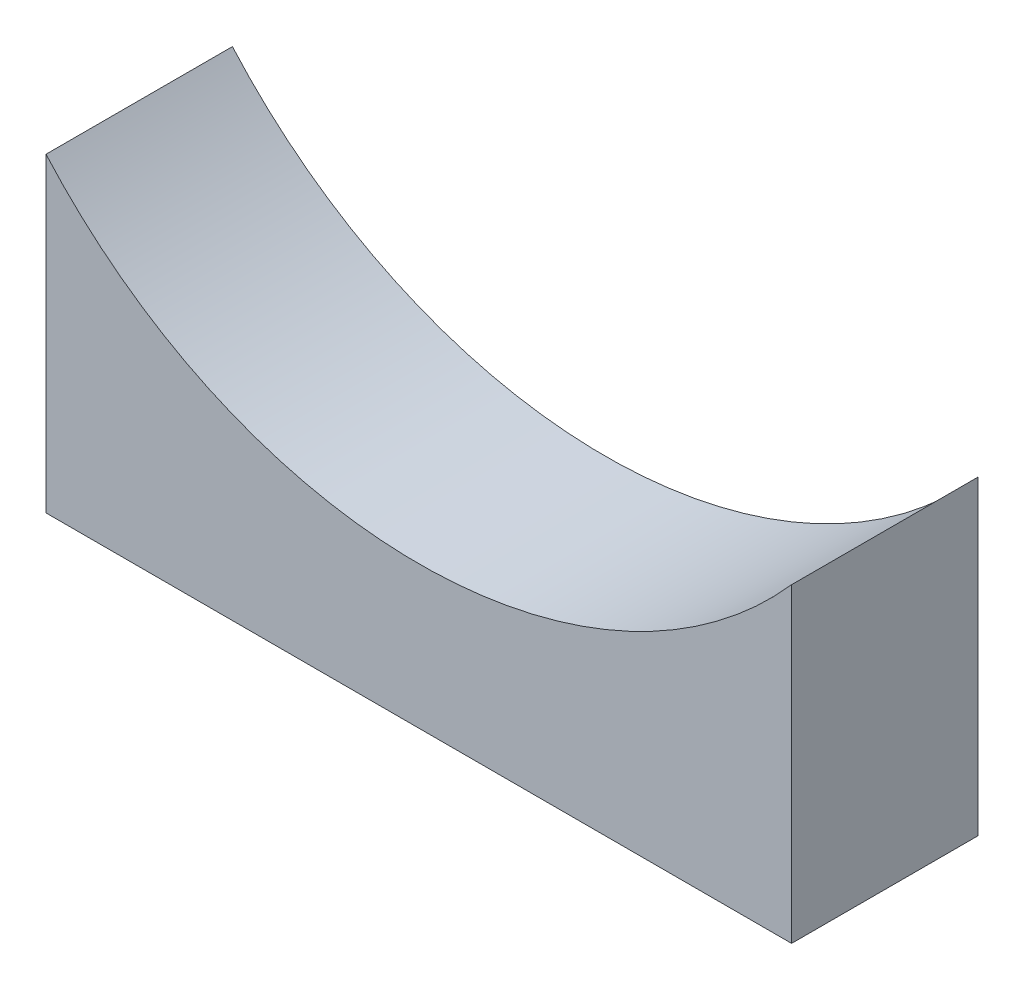
ISO-10303-21;
HEADER;
FILE_DESCRIPTION(('STEP AP214'),'2;1');
FILE_NAME('part.step','',(''),(''),'','','');
FILE_SCHEMA(('AUTOMOTIVE_DESIGN { 1 0 10303 214 1 1 1 1 }'));
ENDSEC;
DATA;
#1=APPLICATION_CONTEXT('core data for automotive mechanical design processes');
#2=APPLICATION_PROTOCOL_DEFINITION('international standard','automotive_design',2000,#1);
#3=PRODUCT_CONTEXT('',#1,'mechanical');
#4=PRODUCT('Part','Part','',(#3));
#5=PRODUCT_RELATED_PRODUCT_CATEGORY('part','',(#4));
#6=PRODUCT_DEFINITION_FORMATION('','',#4);
#7=PRODUCT_DEFINITION_CONTEXT('part definition',#1,'design');
#8=PRODUCT_DEFINITION('design','',#6,#7);
#9=PRODUCT_DEFINITION_SHAPE('','',#8);
#10=(LENGTH_UNIT() NAMED_UNIT(*) SI_UNIT(.MILLI.,.METRE.));
#11=(NAMED_UNIT(*) PLANE_ANGLE_UNIT() SI_UNIT($,.RADIAN.));
#12=(NAMED_UNIT(*) SI_UNIT($,.STERADIAN.) SOLID_ANGLE_UNIT());
#13=UNCERTAINTY_MEASURE_WITH_UNIT(LENGTH_MEASURE(1.E-05),#10,'distance_accuracy_value','');
#14=(GEOMETRIC_REPRESENTATION_CONTEXT(3) GLOBAL_UNCERTAINTY_ASSIGNED_CONTEXT((#13)) GLOBAL_UNIT_ASSIGNED_CONTEXT((#10,
#11,#12)) REPRESENTATION_CONTEXT('',''));
#15=CARTESIAN_POINT('',(0.,0.,0.));
#16=DIRECTION('',(0.,0.,1.));
#17=DIRECTION('',(1.,0.,0.));
#18=AXIS2_PLACEMENT_3D('',#15,#16,#17);
#19=CARTESIAN_POINT('',(-38.1,50.8,19.05));
#20=DIRECTION('',(1.,0.,0.));
#21=DIRECTION('',(0.,1.,0.));
#22=AXIS2_PLACEMENT_3D('',#19,#20,#21);
#23=PLANE('',#22);
#24=DIRECTION('',(0.,0.,-1.));
#25=VECTOR('',#24,1.);
#26=CARTESIAN_POINT('',(-38.1,19.05,19.05));
#27=LINE('',#26,#25);
#28=CARTESIAN_POINT('',(-38.1,19.05,19.05));
#29=VERTEX_POINT('',#28);
#30=CARTESIAN_POINT('',(-38.1,19.05,0.));
#31=VERTEX_POINT('',#30);
#32=EDGE_CURVE('E48',#29,#31,#27,.T.);
#33=ORIENTED_EDGE('',*,*,#32,.F.);
#34=DIRECTION('',(0.,-1.,0.));
#35=VECTOR('',#34,1.);
#36=CARTESIAN_POINT('',(-38.1,50.8,19.05));
#37=LINE('',#36,#35);
#38=CARTESIAN_POINT('',(-38.1,50.8,19.05));
#39=VERTEX_POINT('',#38);
#40=EDGE_CURVE('E95',#39,#29,#37,.T.);
#41=ORIENTED_EDGE('',*,*,#40,.F.);
#42=DIRECTION('',(0.,0.,-1.));
#43=VECTOR('',#42,1.);
#44=CARTESIAN_POINT('',(-38.1,50.8,19.05));
#45=LINE('',#44,#43);
#46=CARTESIAN_POINT('',(-38.1,50.8,0.));
#47=VERTEX_POINT('',#46);
#48=EDGE_CURVE('E11',#39,#47,#45,.T.);
#49=ORIENTED_EDGE('',*,*,#48,.T.);
#50=DIRECTION('',(0.,-1.,0.));
#51=VECTOR('',#50,1.);
#52=CARTESIAN_POINT('',(-38.1,50.8,0.));
#53=LINE('',#52,#51);
#54=EDGE_CURVE('E81',#47,#31,#53,.T.);
#55=ORIENTED_EDGE('',*,*,#54,.T.);
#56=EDGE_LOOP('',(#33,#41,#49,#55));
#57=FACE_BOUND('',#56,.T.);
#58=ADVANCED_FACE('F33',(#57),#23,.F.);
#59=CARTESIAN_POINT('',(38.1,0.,19.05));
#60=DIRECTION('',(-1.,0.,0.));
#61=DIRECTION('',(0.,0.,1.));
#62=AXIS2_PLACEMENT_3D('',#59,#60,#61);
#63=PLANE('',#62);
#64=DIRECTION('',(0.,0.,1.));
#65=VECTOR('',#64,1.);
#66=CARTESIAN_POINT('',(38.1,19.05,0.));
#67=LINE('',#66,#65);
#68=CARTESIAN_POINT('',(38.1,19.05,0.));
#69=VERTEX_POINT('',#68);
#70=CARTESIAN_POINT('',(38.1,19.05,19.05));
#71=VERTEX_POINT('',#70);
#72=EDGE_CURVE('E77',#69,#71,#67,.T.);
#73=ORIENTED_EDGE('',*,*,#72,.F.);
#74=DIRECTION('',(0.,1.,0.));
#75=VECTOR('',#74,1.);
#76=CARTESIAN_POINT('',(38.1,0.,0.));
#77=LINE('',#76,#75);
#78=CARTESIAN_POINT('',(38.1,50.8,0.));
#79=VERTEX_POINT('',#78);
#80=EDGE_CURVE('E71',#69,#79,#77,.T.);
#81=ORIENTED_EDGE('',*,*,#80,.T.);
#82=DIRECTION('',(0.,0.,-1.));
#83=VECTOR('',#82,1.);
#84=CARTESIAN_POINT('',(38.1,50.8,19.05));
#85=LINE('',#84,#83);
#86=CARTESIAN_POINT('',(38.1,50.8,19.05));
#87=VERTEX_POINT('',#86);
#88=EDGE_CURVE('E41',#87,#79,#85,.T.);
#89=ORIENTED_EDGE('',*,*,#88,.F.);
#90=DIRECTION('',(0.,1.,0.));
#91=VECTOR('',#90,1.);
#92=CARTESIAN_POINT('',(38.1,0.,19.05));
#93=LINE('',#92,#91);
#94=EDGE_CURVE('E57',#71,#87,#93,.T.);
#95=ORIENTED_EDGE('',*,*,#94,.F.);
#96=EDGE_LOOP('',(#73,#81,#89,#95));
#97=FACE_BOUND('',#96,.T.);
#98=ADVANCED_FACE('F73',(#97),#63,.F.);
#99=CARTESIAN_POINT('',(0.,84.4010416505203,19.05));
#100=DIRECTION('',(0.,0.,1.));
#101=DIRECTION('',(1.,0.,0.));
#102=AXIS2_PLACEMENT_3D('',#99,#100,#101);
#103=PLANE('',#102);
#104=ORIENTED_EDGE('',*,*,#40,.T.);
#105=DIRECTION('',(-1.,0.,0.));
#106=VECTOR('',#105,1.);
#107=CARTESIAN_POINT('',(38.1,19.05,19.05));
#108=LINE('',#107,#106);
#109=EDGE_CURVE('E89',#71,#29,#108,.T.);
#110=ORIENTED_EDGE('',*,*,#109,.F.);
#111=ORIENTED_EDGE('',*,*,#94,.T.);
#112=CARTESIAN_POINT('',(0.,84.4010416505203,19.05));
#113=DIRECTION('',(0.,0.,-1.));
#114=DIRECTION('',(1.,0.,0.));
#115=AXIS2_PLACEMENT_3D('',#112,#113,#114);
#116=CIRCLE('',#115,50.8);
#117=EDGE_CURVE('E80',#87,#39,#116,.T.);
#118=ORIENTED_EDGE('',*,*,#117,.T.);
#119=EDGE_LOOP('',(#104,#110,#111,#118));
#120=FACE_BOUND('',#119,.T.);
#121=ADVANCED_FACE('F106',(#120),#103,.T.);
#122=CARTESIAN_POINT('',(0.,84.4010416505203,0.));
#123=DIRECTION('',(0.,0.,1.));
#124=DIRECTION('',(1.,0.,0.));
#125=AXIS2_PLACEMENT_3D('',#122,#123,#124);
#126=PLANE('',#125);
#127=DIRECTION('',(1.,0.,0.));
#128=VECTOR('',#127,1.);
#129=CARTESIAN_POINT('',(-38.1,19.05,0.));
#130=LINE('',#129,#128);
#131=EDGE_CURVE('E100',#31,#69,#130,.T.);
#132=ORIENTED_EDGE('',*,*,#131,.F.);
#133=ORIENTED_EDGE('',*,*,#54,.F.);
#134=CARTESIAN_POINT('',(0.,84.4010416505203,0.));
#135=DIRECTION('',(0.,0.,-1.));
#136=DIRECTION('',(1.,0.,0.));
#137=AXIS2_PLACEMENT_3D('',#134,#135,#136);
#138=CIRCLE('',#137,50.8);
#139=EDGE_CURVE('E86',#79,#47,#138,.T.);
#140=ORIENTED_EDGE('',*,*,#139,.F.);
#141=ORIENTED_EDGE('',*,*,#80,.F.);
#142=EDGE_LOOP('',(#132,#133,#140,#141));
#143=FACE_BOUND('',#142,.T.);
#144=ADVANCED_FACE('F87',(#143),#126,.F.);
#145=CARTESIAN_POINT('',(0.,84.4010416505203,19.05));
#146=DIRECTION('',(0.,0.,-1.));
#147=DIRECTION('',(-1.,0.,0.));
#148=AXIS2_PLACEMENT_3D('',#145,#146,#147);
#149=CYLINDRICAL_SURFACE('',#148,50.8);
#150=ORIENTED_EDGE('',*,*,#139,.T.);
#151=ORIENTED_EDGE('',*,*,#48,.F.);
#152=ORIENTED_EDGE('',*,*,#117,.F.);
#153=ORIENTED_EDGE('',*,*,#88,.T.);
#154=EDGE_LOOP('',(#150,#151,#152,#153));
#155=FACE_BOUND('',#154,.T.);
#156=ADVANCED_FACE('F35',(#155),#149,.F.);
#157=CARTESIAN_POINT('',(0.,19.05,0.));
#158=DIRECTION('',(0.,-1.,0.));
#159=DIRECTION('',(1.,0.,0.));
#160=AXIS2_PLACEMENT_3D('',#157,#158,#159);
#161=PLANE('',#160);
#162=ORIENTED_EDGE('',*,*,#32,.T.);
#163=ORIENTED_EDGE('',*,*,#131,.T.);
#164=ORIENTED_EDGE('',*,*,#72,.T.);
#165=ORIENTED_EDGE('',*,*,#109,.T.);
#166=EDGE_LOOP('',(#162,#163,#164,#165));
#167=FACE_BOUND('',#166,.T.);
#168=ADVANCED_FACE('F102',(#167),#161,.T.);
#169=CLOSED_SHELL('',(#58,#98,#121,#144,#156,#168));
#170=MANIFOLD_SOLID_BREP('B2',#169);
#171=ADVANCED_BREP_SHAPE_REPRESENTATION('',(#18,#170),#14);
#172=SHAPE_DEFINITION_REPRESENTATION(#9,#171);
ENDSEC;
END-ISO-10303-21;
